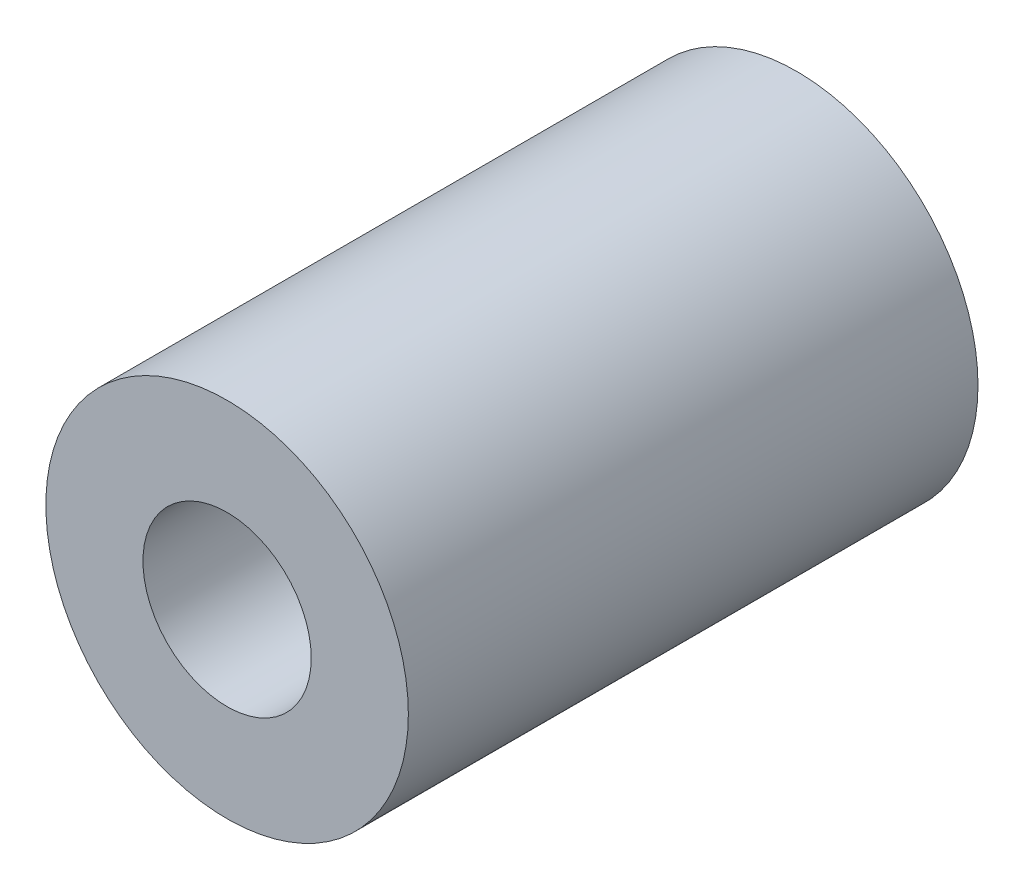
ISO-10303-21;
HEADER;
FILE_DESCRIPTION(('STEP AP214'),'2;1');
FILE_NAME('part.step','',(''),(''),'','','');
FILE_SCHEMA(('AUTOMOTIVE_DESIGN { 1 0 10303 214 1 1 1 1 }'));
ENDSEC;
DATA;
#1=APPLICATION_CONTEXT('core data for automotive mechanical design processes');
#2=APPLICATION_PROTOCOL_DEFINITION('international standard','automotive_design',2000,#1);
#3=PRODUCT_CONTEXT('',#1,'mechanical');
#4=PRODUCT('Part','Part','',(#3));
#5=PRODUCT_RELATED_PRODUCT_CATEGORY('part','',(#4));
#6=PRODUCT_DEFINITION_FORMATION('','',#4);
#7=PRODUCT_DEFINITION_CONTEXT('part definition',#1,'design');
#8=PRODUCT_DEFINITION('design','',#6,#7);
#9=PRODUCT_DEFINITION_SHAPE('','',#8);
#10=(LENGTH_UNIT() NAMED_UNIT(*) SI_UNIT(.MILLI.,.METRE.));
#11=(NAMED_UNIT(*) PLANE_ANGLE_UNIT() SI_UNIT($,.RADIAN.));
#12=(NAMED_UNIT(*) SI_UNIT($,.STERADIAN.) SOLID_ANGLE_UNIT());
#13=UNCERTAINTY_MEASURE_WITH_UNIT(LENGTH_MEASURE(1.E-05),#10,'distance_accuracy_value','');
#14=(GEOMETRIC_REPRESENTATION_CONTEXT(3) GLOBAL_UNCERTAINTY_ASSIGNED_CONTEXT((#13)) GLOBAL_UNIT_ASSIGNED_CONTEXT((#10,
#11,#12)) REPRESENTATION_CONTEXT('',''));
#15=CARTESIAN_POINT('',(0.,0.,0.));
#16=DIRECTION('',(0.,0.,1.));
#17=DIRECTION('',(1.,0.,0.));
#18=AXIS2_PLACEMENT_3D('',#15,#16,#17);
#19=CARTESIAN_POINT('',(0.,0.,11.));
#20=DIRECTION('',(0.,0.,-1.));
#21=DIRECTION('',(-1.,0.,0.));
#22=AXIS2_PLACEMENT_3D('',#19,#20,#21);
#23=CYLINDRICAL_SURFACE('',#22,7.);
#24=CARTESIAN_POINT('',(0.,0.,11.));
#25=DIRECTION('',(0.,0.,1.));
#26=DIRECTION('',(1.,0.,0.));
#27=AXIS2_PLACEMENT_3D('',#24,#25,#26);
#28=CIRCLE('',#27,7.);
#29=CARTESIAN_POINT('',(7.,0.,11.));
#30=VERTEX_POINT('',#29);
#31=EDGE_CURVE('E10',#30,#30,#28,.T.);
#32=ORIENTED_EDGE('',*,*,#31,.F.);
#33=EDGE_LOOP('',(#32));
#34=FACE_BOUND('',#33,.T.);
#35=CARTESIAN_POINT('',(0.,0.,-11.));
#36=DIRECTION('',(0.,0.,1.));
#37=DIRECTION('',(1.,0.,0.));
#38=AXIS2_PLACEMENT_3D('',#35,#36,#37);
#39=CIRCLE('',#38,7.);
#40=CARTESIAN_POINT('',(7.,0.,-11.));
#41=VERTEX_POINT('',#40);
#42=EDGE_CURVE('E42',#41,#41,#39,.T.);
#43=ORIENTED_EDGE('',*,*,#42,.T.);
#44=EDGE_LOOP('',(#43));
#45=FACE_BOUND('',#44,.T.);
#46=ADVANCED_FACE('F39',(#34,#45),#23,.T.);
#47=CARTESIAN_POINT('',(0.,0.,11.));
#48=DIRECTION('',(0.,0.,1.));
#49=DIRECTION('',(1.,0.,0.));
#50=AXIS2_PLACEMENT_3D('',#47,#48,#49);
#51=PLANE('',#50);
#52=CARTESIAN_POINT('',(0.,0.,11.));
#53=DIRECTION('',(0.,0.,1.));
#54=DIRECTION('',(1.,0.,0.));
#55=AXIS2_PLACEMENT_3D('',#52,#53,#54);
#56=CIRCLE('',#55,3.25);
#57=CARTESIAN_POINT('',(3.25,0.,11.));
#58=VERTEX_POINT('',#57);
#59=EDGE_CURVE('E51',#58,#58,#56,.T.);
#60=ORIENTED_EDGE('',*,*,#59,.F.);
#61=EDGE_LOOP('',(#60));
#62=FACE_BOUND('',#61,.T.);
#63=ORIENTED_EDGE('',*,*,#31,.T.);
#64=EDGE_LOOP('',(#63));
#65=FACE_BOUND('',#64,.T.);
#66=ADVANCED_FACE('F71',(#62,#65),#51,.T.);
#67=CARTESIAN_POINT('',(0.,0.,-11.));
#68=DIRECTION('',(0.,0.,1.));
#69=DIRECTION('',(1.,0.,0.));
#70=AXIS2_PLACEMENT_3D('',#67,#68,#69);
#71=PLANE('',#70);
#72=CARTESIAN_POINT('',(0.,0.,-11.));
#73=DIRECTION('',(0.,0.,1.));
#74=DIRECTION('',(1.,0.,0.));
#75=AXIS2_PLACEMENT_3D('',#72,#73,#74);
#76=CIRCLE('',#75,3.25);
#77=CARTESIAN_POINT('',(3.25,0.,-11.));
#78=VERTEX_POINT('',#77);
#79=EDGE_CURVE('E56',#78,#78,#76,.T.);
#80=ORIENTED_EDGE('',*,*,#79,.T.);
#81=EDGE_LOOP('',(#80));
#82=FACE_BOUND('',#81,.T.);
#83=ORIENTED_EDGE('',*,*,#42,.F.);
#84=EDGE_LOOP('',(#83));
#85=FACE_BOUND('',#84,.T.);
#86=ADVANCED_FACE('F61',(#82,#85),#71,.F.);
#87=CARTESIAN_POINT('',(0.,0.,-11.));
#88=DIRECTION('',(0.,0.,1.));
#89=DIRECTION('',(1.,0.,0.));
#90=AXIS2_PLACEMENT_3D('',#87,#88,#89);
#91=CYLINDRICAL_SURFACE('',#90,3.25);
#92=ORIENTED_EDGE('',*,*,#59,.T.);
#93=EDGE_LOOP('',(#92));
#94=FACE_BOUND('',#93,.T.);
#95=ORIENTED_EDGE('',*,*,#79,.F.);
#96=EDGE_LOOP('',(#95));
#97=FACE_BOUND('',#96,.T.);
#98=ADVANCED_FACE('F64',(#94,#97),#91,.F.);
#99=CLOSED_SHELL('',(#46,#66,#86,#98));
#100=MANIFOLD_SOLID_BREP('B2',#99);
#101=ADVANCED_BREP_SHAPE_REPRESENTATION('',(#18,#100),#14);
#102=SHAPE_DEFINITION_REPRESENTATION(#9,#101);
ENDSEC;
END-ISO-10303-21;
